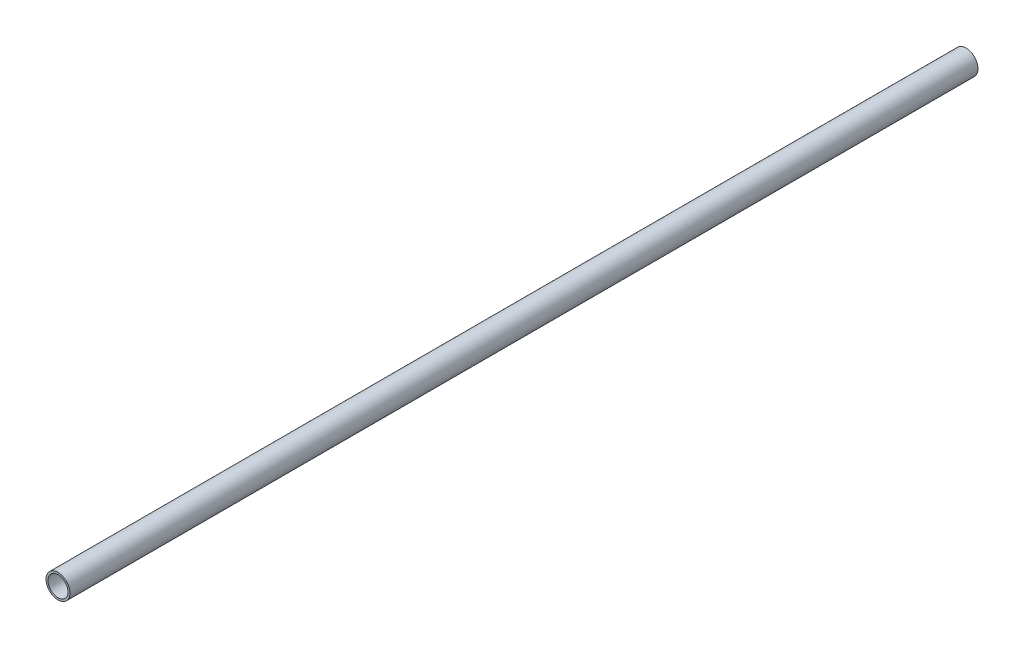
ISO-10303-21;
HEADER;
FILE_DESCRIPTION(('STEP AP214'),'2;1');
FILE_NAME('part.step','',(''),(''),'','','');
FILE_SCHEMA(('AUTOMOTIVE_DESIGN { 1 0 10303 214 1 1 1 1 }'));
ENDSEC;
DATA;
#1=APPLICATION_CONTEXT('core data for automotive mechanical design processes');
#2=APPLICATION_PROTOCOL_DEFINITION('international standard','automotive_design',2000,#1);
#3=PRODUCT_CONTEXT('',#1,'mechanical');
#4=PRODUCT('Part','Part','',(#3));
#5=PRODUCT_RELATED_PRODUCT_CATEGORY('part','',(#4));
#6=PRODUCT_DEFINITION_FORMATION('','',#4);
#7=PRODUCT_DEFINITION_CONTEXT('part definition',#1,'design');
#8=PRODUCT_DEFINITION('design','',#6,#7);
#9=PRODUCT_DEFINITION_SHAPE('','',#8);
#10=(LENGTH_UNIT() NAMED_UNIT(*) SI_UNIT(.MILLI.,.METRE.));
#11=(NAMED_UNIT(*) PLANE_ANGLE_UNIT() SI_UNIT($,.RADIAN.));
#12=(NAMED_UNIT(*) SI_UNIT($,.STERADIAN.) SOLID_ANGLE_UNIT());
#13=UNCERTAINTY_MEASURE_WITH_UNIT(LENGTH_MEASURE(1.E-05),#10,'distance_accuracy_value','');
#14=(GEOMETRIC_REPRESENTATION_CONTEXT(3) GLOBAL_UNCERTAINTY_ASSIGNED_CONTEXT((#13)) GLOBAL_UNIT_ASSIGNED_CONTEXT((#10,
#11,#12)) REPRESENTATION_CONTEXT('',''));
#15=CARTESIAN_POINT('',(0.,0.,0.));
#16=DIRECTION('',(0.,0.,1.));
#17=DIRECTION('',(1.,0.,0.));
#18=AXIS2_PLACEMENT_3D('',#15,#16,#17);
#19=CARTESIAN_POINT('',(0.,0.,1828.8));
#20=DIRECTION('',(0.,0.,1.));
#21=DIRECTION('',(1.,0.,0.));
#22=AXIS2_PLACEMENT_3D('',#19,#20,#21);
#23=PLANE('',#22);
#24=CARTESIAN_POINT('',(0.,0.,1828.8));
#25=DIRECTION('',(0.,0.,1.));
#26=DIRECTION('',(1.,0.,0.));
#27=AXIS2_PLACEMENT_3D('',#24,#25,#26);
#28=CIRCLE('',#27,24.13);
#29=CARTESIAN_POINT('',(-24.13,0.,1828.8));
#30=VERTEX_POINT('',#29);
#31=EDGE_CURVE('E10',#30,#30,#28,.T.);
#32=ORIENTED_EDGE('',*,*,#31,.T.);
#33=EDGE_LOOP('',(#32));
#34=FACE_BOUND('',#33,.T.);
#35=CARTESIAN_POINT('',(0.,0.,1828.8));
#36=DIRECTION('',(0.,0.,1.));
#37=DIRECTION('',(1.,0.,0.));
#38=AXIS2_PLACEMENT_3D('',#35,#36,#37);
#39=CIRCLE('',#38,20.193);
#40=CARTESIAN_POINT('',(-20.193,0.,1828.8));
#41=VERTEX_POINT('',#40);
#42=EDGE_CURVE('E49',#41,#41,#39,.T.);
#43=ORIENTED_EDGE('',*,*,#42,.F.);
#44=EDGE_LOOP('',(#43));
#45=FACE_BOUND('',#44,.T.);
#46=ADVANCED_FACE('F35',(#34,#45),#23,.T.);
#47=CARTESIAN_POINT('',(0.,0.,0.));
#48=DIRECTION('',(0.,0.,1.));
#49=DIRECTION('',(1.,0.,0.));
#50=AXIS2_PLACEMENT_3D('',#47,#48,#49);
#51=PLANE('',#50);
#52=CARTESIAN_POINT('',(0.,0.,0.));
#53=DIRECTION('',(0.,0.,1.));
#54=DIRECTION('',(1.,0.,0.));
#55=AXIS2_PLACEMENT_3D('',#52,#53,#54);
#56=CIRCLE('',#55,24.13);
#57=CARTESIAN_POINT('',(-24.13,0.,-2.22044604925031E-13));
#58=VERTEX_POINT('',#57);
#59=EDGE_CURVE('E39',#58,#58,#56,.T.);
#60=ORIENTED_EDGE('',*,*,#59,.F.);
#61=EDGE_LOOP('',(#60));
#62=FACE_BOUND('',#61,.T.);
#63=CARTESIAN_POINT('',(0.,0.,0.));
#64=DIRECTION('',(0.,0.,1.));
#65=DIRECTION('',(1.,0.,0.));
#66=AXIS2_PLACEMENT_3D('',#63,#64,#65);
#67=CIRCLE('',#66,20.193);
#68=CARTESIAN_POINT('',(-20.193,0.,-2.22044604925031E-13));
#69=VERTEX_POINT('',#68);
#70=EDGE_CURVE('E51',#69,#69,#67,.T.);
#71=ORIENTED_EDGE('',*,*,#70,.T.);
#72=EDGE_LOOP('',(#71));
#73=FACE_BOUND('',#72,.T.);
#74=ADVANCED_FACE('F62',(#62,#73),#51,.F.);
#75=CARTESIAN_POINT('',(0.,0.,1828.8));
#76=DIRECTION('',(0.,0.,-1.));
#77=DIRECTION('',(-1.,0.,0.));
#78=AXIS2_PLACEMENT_3D('',#75,#76,#77);
#79=CYLINDRICAL_SURFACE('',#78,24.13);
#80=CARTESIAN_POINT('',(-24.13,0.,1828.8));
#81=CARTESIAN_POINT('',(-24.13,0.,1809.75));
#82=CARTESIAN_POINT('',(-24.13,0.,1790.7));
#83=CARTESIAN_POINT('',(-24.13,0.,1752.6));
#84=CARTESIAN_POINT('',(-24.13,0.,1733.55));
#85=CARTESIAN_POINT('',(-24.13,0.,1695.45));
#86=CARTESIAN_POINT('',(-24.13,0.,1676.4));
#87=CARTESIAN_POINT('',(-24.13,0.,1638.3));
#88=CARTESIAN_POINT('',(-24.13,0.,1619.25));
#89=CARTESIAN_POINT('',(-24.13,0.,1581.15));
#90=CARTESIAN_POINT('',(-24.13,0.,1562.1));
#91=CARTESIAN_POINT('',(-24.13,0.,1524.));
#92=CARTESIAN_POINT('',(-24.13,0.,1504.95));
#93=CARTESIAN_POINT('',(-24.13,0.,1466.85));
#94=CARTESIAN_POINT('',(-24.13,0.,1447.8));
#95=CARTESIAN_POINT('',(-24.13,0.,1409.7));
#96=CARTESIAN_POINT('',(-24.13,0.,1390.65));
#97=CARTESIAN_POINT('',(-24.13,0.,1352.55));
#98=CARTESIAN_POINT('',(-24.13,0.,1333.5));
#99=CARTESIAN_POINT('',(-24.13,0.,1295.4));
#100=CARTESIAN_POINT('',(-24.13,0.,1276.35));
#101=CARTESIAN_POINT('',(-24.13,0.,1238.25));
#102=CARTESIAN_POINT('',(-24.13,0.,1219.2));
#103=CARTESIAN_POINT('',(-24.13,0.,1181.1));
#104=CARTESIAN_POINT('',(-24.13,0.,1162.05));
#105=CARTESIAN_POINT('',(-24.13,0.,1123.95));
#106=CARTESIAN_POINT('',(-24.13,0.,1104.9));
#107=CARTESIAN_POINT('',(-24.13,0.,1066.8));
#108=CARTESIAN_POINT('',(-24.13,0.,1047.75));
#109=CARTESIAN_POINT('',(-24.13,0.,1009.65));
#110=CARTESIAN_POINT('',(-24.13,0.,990.6));
#111=CARTESIAN_POINT('',(-24.13,0.,952.5));
#112=CARTESIAN_POINT('',(-24.13,0.,933.45));
#113=CARTESIAN_POINT('',(-24.13,0.,895.35));
#114=CARTESIAN_POINT('',(-24.13,0.,876.3));
#115=CARTESIAN_POINT('',(-24.13,0.,838.2));
#116=CARTESIAN_POINT('',(-24.13,0.,819.15));
#117=CARTESIAN_POINT('',(-24.13,0.,781.05));
#118=CARTESIAN_POINT('',(-24.13,0.,762.));
#119=CARTESIAN_POINT('',(-24.13,0.,723.9));
#120=CARTESIAN_POINT('',(-24.13,0.,704.85));
#121=CARTESIAN_POINT('',(-24.13,0.,666.75));
#122=CARTESIAN_POINT('',(-24.13,0.,647.7));
#123=CARTESIAN_POINT('',(-24.13,0.,609.6));
#124=CARTESIAN_POINT('',(-24.13,0.,590.55));
#125=CARTESIAN_POINT('',(-24.13,0.,552.45));
#126=CARTESIAN_POINT('',(-24.13,0.,533.4));
#127=CARTESIAN_POINT('',(-24.13,0.,495.3));
#128=CARTESIAN_POINT('',(-24.13,0.,476.25));
#129=CARTESIAN_POINT('',(-24.13,0.,438.15));
#130=CARTESIAN_POINT('',(-24.13,0.,419.1));
#131=CARTESIAN_POINT('',(-24.13,0.,381.));
#132=CARTESIAN_POINT('',(-24.13,0.,361.95));
#133=CARTESIAN_POINT('',(-24.13,0.,323.85));
#134=CARTESIAN_POINT('',(-24.13,0.,304.8));
#135=CARTESIAN_POINT('',(-24.13,0.,266.7));
#136=CARTESIAN_POINT('',(-24.13,0.,247.65));
#137=CARTESIAN_POINT('',(-24.13,0.,209.55));
#138=CARTESIAN_POINT('',(-24.13,0.,190.5));
#139=CARTESIAN_POINT('',(-24.13,0.,152.4));
#140=CARTESIAN_POINT('',(-24.13,0.,133.35));
#141=CARTESIAN_POINT('',(-24.13,0.,95.2499999999998));
#142=CARTESIAN_POINT('',(-24.13,0.,76.1999999999998));
#143=CARTESIAN_POINT('',(-24.13,0.,38.0999999999998));
#144=CARTESIAN_POINT('',(-24.13,0.,19.0499999999998));
#145=CARTESIAN_POINT('',(-24.13,0.,-2.22044604925031E-13));
#146=B_SPLINE_CURVE_WITH_KNOTS('',3,(#80,#81,#82,#83,#84,#85,#86,#87,#88,#89,#90,#91,#92,#93,
#94,#95,#96,#97,#98,#99,#100,#101,#102,#103,#104,#105,#106,#107,#108,#109,#110,#111,#112,#113,
#114,#115,#116,#117,#118,#119,#120,#121,#122,#123,#124,#125,#126,#127,#128,#129,#130,#131,#132,
#133,#134,#135,#136,#137,#138,#139,#140,#141,#142,#143,#144,#145),.UNSPECIFIED.,.F.,.F.,(4,2,2,
2,2,2,2,2,2,2,2,2,2,2,2,2,2,2,2,2,2,2,2,2,2,2,2,2,2,2,2,2,4),(0.,57.1499999999998,114.3,171.45,
228.6,285.75,342.9,400.05,457.2,514.35,571.5,628.65,685.8,742.95,800.1,857.25,914.4,971.55,
1028.7,1085.85,1143.,1200.15,1257.3,1314.45,1371.6,1428.75,1485.9,1543.05,1600.2,1657.35,1714.5,
1771.65,1828.8),.UNSPECIFIED.);
#147=EDGE_CURVE('BSEAM37',#30,#58,#146,.T.);
#148=ORIENTED_EDGE('',*,*,#31,.F.);
#149=ORIENTED_EDGE('',*,*,#59,.T.);
#150=ORIENTED_EDGE('',*,*,#147,.T.);
#151=ORIENTED_EDGE('',*,*,#147,.F.);
#152=EDGE_LOOP('',(#148,#150,#149,#151));
#153=FACE_BOUND('',#152,.T.);
#154=ADVANCED_FACE('F37',(#153),#79,.T.);
#155=CARTESIAN_POINT('',(0.,0.,1828.8));
#156=DIRECTION('',(0.,0.,-1.));
#157=DIRECTION('',(-1.,0.,0.));
#158=AXIS2_PLACEMENT_3D('',#155,#156,#157);
#159=CYLINDRICAL_SURFACE('',#158,20.193);
#160=CARTESIAN_POINT('',(-20.193,0.,1828.8));
#161=CARTESIAN_POINT('',(-20.193,0.,1809.75));
#162=CARTESIAN_POINT('',(-20.193,0.,1790.7));
#163=CARTESIAN_POINT('',(-20.193,0.,1752.6));
#164=CARTESIAN_POINT('',(-20.193,0.,1733.55));
#165=CARTESIAN_POINT('',(-20.193,0.,1695.45));
#166=CARTESIAN_POINT('',(-20.193,0.,1676.4));
#167=CARTESIAN_POINT('',(-20.193,0.,1638.3));
#168=CARTESIAN_POINT('',(-20.193,0.,1619.25));
#169=CARTESIAN_POINT('',(-20.193,0.,1581.15));
#170=CARTESIAN_POINT('',(-20.193,0.,1562.1));
#171=CARTESIAN_POINT('',(-20.193,0.,1524.));
#172=CARTESIAN_POINT('',(-20.193,0.,1504.95));
#173=CARTESIAN_POINT('',(-20.193,0.,1466.85));
#174=CARTESIAN_POINT('',(-20.193,0.,1447.8));
#175=CARTESIAN_POINT('',(-20.193,0.,1409.7));
#176=CARTESIAN_POINT('',(-20.193,0.,1390.65));
#177=CARTESIAN_POINT('',(-20.193,0.,1352.55));
#178=CARTESIAN_POINT('',(-20.193,0.,1333.5));
#179=CARTESIAN_POINT('',(-20.193,0.,1295.4));
#180=CARTESIAN_POINT('',(-20.193,0.,1276.35));
#181=CARTESIAN_POINT('',(-20.193,0.,1238.25));
#182=CARTESIAN_POINT('',(-20.193,0.,1219.2));
#183=CARTESIAN_POINT('',(-20.193,0.,1181.1));
#184=CARTESIAN_POINT('',(-20.193,0.,1162.05));
#185=CARTESIAN_POINT('',(-20.193,0.,1123.95));
#186=CARTESIAN_POINT('',(-20.193,0.,1104.9));
#187=CARTESIAN_POINT('',(-20.193,0.,1066.8));
#188=CARTESIAN_POINT('',(-20.193,0.,1047.75));
#189=CARTESIAN_POINT('',(-20.193,0.,1009.65));
#190=CARTESIAN_POINT('',(-20.193,0.,990.6));
#191=CARTESIAN_POINT('',(-20.193,0.,952.5));
#192=CARTESIAN_POINT('',(-20.193,0.,933.45));
#193=CARTESIAN_POINT('',(-20.193,0.,895.35));
#194=CARTESIAN_POINT('',(-20.193,0.,876.3));
#195=CARTESIAN_POINT('',(-20.193,0.,838.2));
#196=CARTESIAN_POINT('',(-20.193,0.,819.15));
#197=CARTESIAN_POINT('',(-20.193,0.,781.05));
#198=CARTESIAN_POINT('',(-20.193,0.,762.));
#199=CARTESIAN_POINT('',(-20.193,0.,723.9));
#200=CARTESIAN_POINT('',(-20.193,0.,704.85));
#201=CARTESIAN_POINT('',(-20.193,0.,666.75));
#202=CARTESIAN_POINT('',(-20.193,0.,647.7));
#203=CARTESIAN_POINT('',(-20.193,0.,609.6));
#204=CARTESIAN_POINT('',(-20.193,0.,590.55));
#205=CARTESIAN_POINT('',(-20.193,0.,552.45));
#206=CARTESIAN_POINT('',(-20.193,0.,533.4));
#207=CARTESIAN_POINT('',(-20.193,0.,495.3));
#208=CARTESIAN_POINT('',(-20.193,0.,476.25));
#209=CARTESIAN_POINT('',(-20.193,0.,438.15));
#210=CARTESIAN_POINT('',(-20.193,0.,419.1));
#211=CARTESIAN_POINT('',(-20.193,0.,381.));
#212=CARTESIAN_POINT('',(-20.193,0.,361.95));
#213=CARTESIAN_POINT('',(-20.193,0.,323.85));
#214=CARTESIAN_POINT('',(-20.193,0.,304.8));
#215=CARTESIAN_POINT('',(-20.193,0.,266.7));
#216=CARTESIAN_POINT('',(-20.193,0.,247.65));
#217=CARTESIAN_POINT('',(-20.193,0.,209.55));
#218=CARTESIAN_POINT('',(-20.193,0.,190.5));
#219=CARTESIAN_POINT('',(-20.193,0.,152.4));
#220=CARTESIAN_POINT('',(-20.193,0.,133.35));
#221=CARTESIAN_POINT('',(-20.193,0.,95.2499999999998));
#222=CARTESIAN_POINT('',(-20.193,0.,76.1999999999998));
#223=CARTESIAN_POINT('',(-20.193,0.,38.0999999999998));
#224=CARTESIAN_POINT('',(-20.193,0.,19.0499999999998));
#225=CARTESIAN_POINT('',(-20.193,0.,-2.22044604925031E-13));
#226=B_SPLINE_CURVE_WITH_KNOTS('',3,(#160,#161,#162,#163,#164,#165,#166,#167,#168,#169,#170,
#171,#172,#173,#174,#175,#176,#177,#178,#179,#180,#181,#182,#183,#184,#185,#186,#187,#188,#189,
#190,#191,#192,#193,#194,#195,#196,#197,#198,#199,#200,#201,#202,#203,#204,#205,#206,#207,#208,
#209,#210,#211,#212,#213,#214,#215,#216,#217,#218,#219,#220,#221,#222,#223,#224,#225),
.UNSPECIFIED.,.F.,.F.,(4,2,2,2,2,2,2,2,2,2,2,2,2,2,2,2,2,2,2,2,2,2,2,2,2,2,2,2,2,2,2,2,4),(0.,
57.15,114.3,171.45,228.6,285.75,342.9,400.05,457.2,514.35,571.5,628.65,685.8,742.95,800.1,
857.25,914.4,971.55,1028.7,1085.85,1143.,1200.15,1257.3,1314.45,1371.6,1428.75,1485.9,1543.05,
1600.2,1657.35,1714.5,1771.65,1828.8),.UNSPECIFIED.);
#227=EDGE_CURVE('BSEAM58',#41,#69,#226,.T.);
#228=ORIENTED_EDGE('',*,*,#42,.T.);
#229=ORIENTED_EDGE('',*,*,#70,.F.);
#230=ORIENTED_EDGE('',*,*,#227,.T.);
#231=ORIENTED_EDGE('',*,*,#227,.F.);
#232=EDGE_LOOP('',(#228,#230,#229,#231));
#233=FACE_BOUND('',#232,.T.);
#234=ADVANCED_FACE('F58',(#233),#159,.F.);
#235=CLOSED_SHELL('',(#46,#74,#154,#234));
#236=MANIFOLD_SOLID_BREP('B2',#235);
#237=ADVANCED_BREP_SHAPE_REPRESENTATION('',(#18,#236),#14);
#238=SHAPE_DEFINITION_REPRESENTATION(#9,#237);
ENDSEC;
END-ISO-10303-21;
